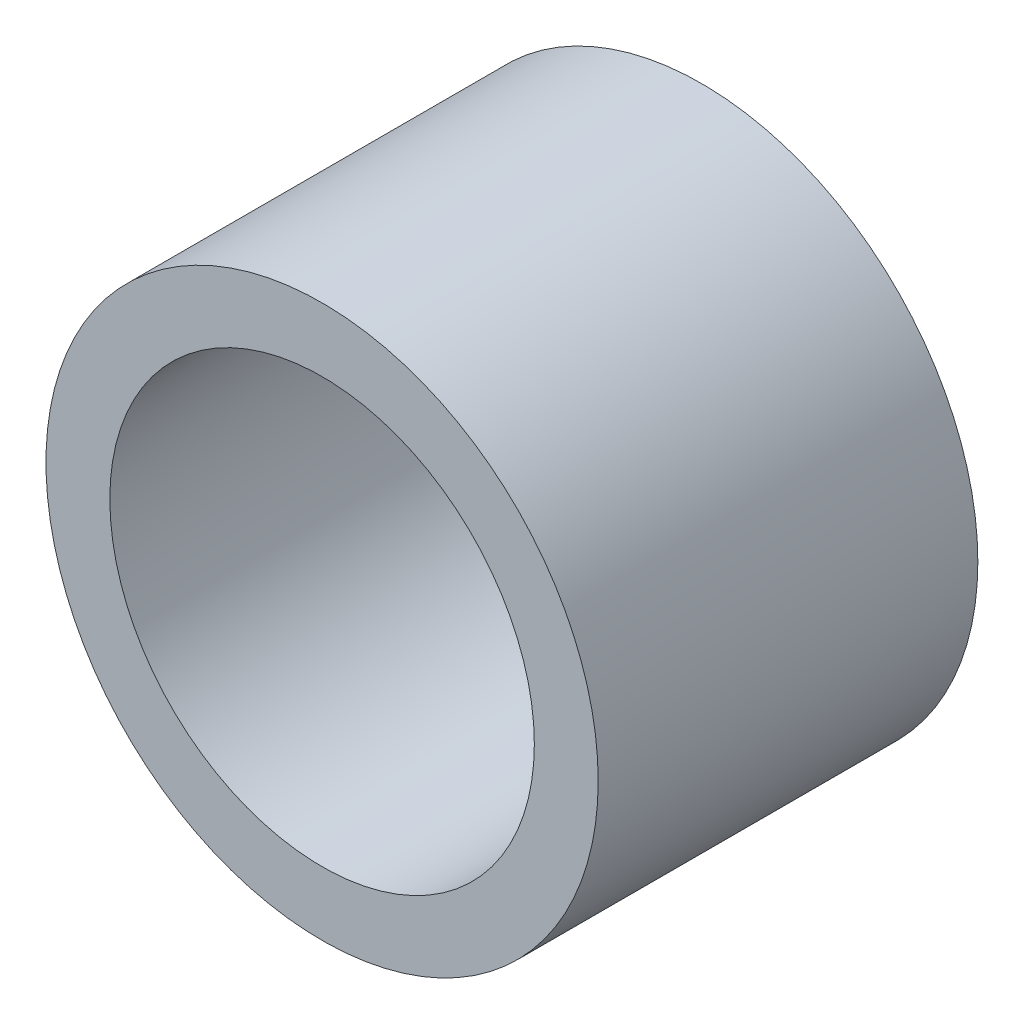
ISO-10303-21;
HEADER;
FILE_DESCRIPTION(('STEP AP214'),'2;1');
FILE_NAME('part.step','',(''),(''),'','','');
FILE_SCHEMA(('AUTOMOTIVE_DESIGN { 1 0 10303 214 1 1 1 1 }'));
ENDSEC;
DATA;
#1=APPLICATION_CONTEXT('core data for automotive mechanical design processes');
#2=APPLICATION_PROTOCOL_DEFINITION('international standard','automotive_design',2000,#1);
#3=PRODUCT_CONTEXT('',#1,'mechanical');
#4=PRODUCT('Part','Part','',(#3));
#5=PRODUCT_RELATED_PRODUCT_CATEGORY('part','',(#4));
#6=PRODUCT_DEFINITION_FORMATION('','',#4);
#7=PRODUCT_DEFINITION_CONTEXT('part definition',#1,'design');
#8=PRODUCT_DEFINITION('design','',#6,#7);
#9=PRODUCT_DEFINITION_SHAPE('','',#8);
#10=(LENGTH_UNIT() NAMED_UNIT(*) SI_UNIT(.MILLI.,.METRE.));
#11=(NAMED_UNIT(*) PLANE_ANGLE_UNIT() SI_UNIT($,.RADIAN.));
#12=(NAMED_UNIT(*) SI_UNIT($,.STERADIAN.) SOLID_ANGLE_UNIT());
#13=UNCERTAINTY_MEASURE_WITH_UNIT(LENGTH_MEASURE(1.E-05),#10,'distance_accuracy_value','');
#14=(GEOMETRIC_REPRESENTATION_CONTEXT(3) GLOBAL_UNCERTAINTY_ASSIGNED_CONTEXT((#13)) GLOBAL_UNIT_ASSIGNED_CONTEXT((#10,
#11,#12)) REPRESENTATION_CONTEXT('',''));
#15=CARTESIAN_POINT('',(0.,0.,0.));
#16=DIRECTION('',(0.,0.,1.));
#17=DIRECTION('',(1.,0.,0.));
#18=AXIS2_PLACEMENT_3D('',#15,#16,#17);
#19=CARTESIAN_POINT('',(0.,0.,11.));
#20=DIRECTION('',(0.,0.,1.));
#21=DIRECTION('',(1.,0.,0.));
#22=AXIS2_PLACEMENT_3D('',#19,#20,#21);
#23=PLANE('',#22);
#24=CARTESIAN_POINT('',(0.,0.,11.));
#25=DIRECTION('',(0.,0.,1.));
#26=DIRECTION('',(1.,0.,0.));
#27=AXIS2_PLACEMENT_3D('',#24,#25,#26);
#28=CIRCLE('',#27,8.);
#29=CARTESIAN_POINT('',(8.,0.,11.));
#30=VERTEX_POINT('',#29);
#31=EDGE_CURVE('E10',#30,#30,#28,.T.);
#32=ORIENTED_EDGE('',*,*,#31,.T.);
#33=EDGE_LOOP('',(#32));
#34=FACE_BOUND('',#33,.T.);
#35=CARTESIAN_POINT('',(0.,0.,11.));
#36=DIRECTION('',(0.,0.,1.));
#37=DIRECTION('',(1.,0.,0.));
#38=AXIS2_PLACEMENT_3D('',#35,#36,#37);
#39=CIRCLE('',#38,6.15);
#40=CARTESIAN_POINT('',(6.15,0.,11.));
#41=VERTEX_POINT('',#40);
#42=EDGE_CURVE('E48',#41,#41,#39,.T.);
#43=ORIENTED_EDGE('',*,*,#42,.F.);
#44=EDGE_LOOP('',(#43));
#45=FACE_BOUND('',#44,.T.);
#46=ADVANCED_FACE('F40',(#34,#45),#23,.T.);
#47=CARTESIAN_POINT('',(0.,0.,0.));
#48=DIRECTION('',(0.,0.,1.));
#49=DIRECTION('',(1.,0.,0.));
#50=AXIS2_PLACEMENT_3D('',#47,#48,#49);
#51=PLANE('',#50);
#52=CARTESIAN_POINT('',(0.,0.,0.));
#53=DIRECTION('',(0.,0.,1.));
#54=DIRECTION('',(1.,0.,0.));
#55=AXIS2_PLACEMENT_3D('',#52,#53,#54);
#56=CIRCLE('',#55,8.);
#57=CARTESIAN_POINT('',(8.,0.,0.));
#58=VERTEX_POINT('',#57);
#59=EDGE_CURVE('E41',#58,#58,#56,.T.);
#60=ORIENTED_EDGE('',*,*,#59,.F.);
#61=EDGE_LOOP('',(#60));
#62=FACE_BOUND('',#61,.T.);
#63=CARTESIAN_POINT('',(0.,0.,0.));
#64=DIRECTION('',(0.,0.,1.));
#65=DIRECTION('',(1.,0.,0.));
#66=AXIS2_PLACEMENT_3D('',#63,#64,#65);
#67=CIRCLE('',#66,6.15);
#68=CARTESIAN_POINT('',(6.15,0.,0.));
#69=VERTEX_POINT('',#68);
#70=EDGE_CURVE('E49',#69,#69,#67,.T.);
#71=ORIENTED_EDGE('',*,*,#70,.T.);
#72=EDGE_LOOP('',(#71));
#73=FACE_BOUND('',#72,.T.);
#74=ADVANCED_FACE('F58',(#62,#73),#51,.F.);
#75=CARTESIAN_POINT('',(0.,0.,11.));
#76=DIRECTION('',(0.,0.,-1.));
#77=DIRECTION('',(-1.,0.,0.));
#78=AXIS2_PLACEMENT_3D('',#75,#76,#77);
#79=CYLINDRICAL_SURFACE('',#78,8.);
#80=ORIENTED_EDGE('',*,*,#31,.F.);
#81=EDGE_LOOP('',(#80));
#82=FACE_BOUND('',#81,.T.);
#83=ORIENTED_EDGE('',*,*,#59,.T.);
#84=EDGE_LOOP('',(#83));
#85=FACE_BOUND('',#84,.T.);
#86=ADVANCED_FACE('F39',(#82,#85),#79,.T.);
#87=CARTESIAN_POINT('',(0.,0.,11.));
#88=DIRECTION('',(0.,0.,-1.));
#89=DIRECTION('',(-1.,0.,0.));
#90=AXIS2_PLACEMENT_3D('',#87,#88,#89);
#91=CYLINDRICAL_SURFACE('',#90,6.15);
#92=ORIENTED_EDGE('',*,*,#42,.T.);
#93=EDGE_LOOP('',(#92));
#94=FACE_BOUND('',#93,.T.);
#95=ORIENTED_EDGE('',*,*,#70,.F.);
#96=EDGE_LOOP('',(#95));
#97=FACE_BOUND('',#96,.T.);
#98=ADVANCED_FACE('F57',(#94,#97),#91,.F.);
#99=CLOSED_SHELL('',(#46,#74,#86,#98));
#100=MANIFOLD_SOLID_BREP('B2',#99);
#101=ADVANCED_BREP_SHAPE_REPRESENTATION('',(#18,#100),#14);
#102=SHAPE_DEFINITION_REPRESENTATION(#9,#101);
ENDSEC;
END-ISO-10303-21;
